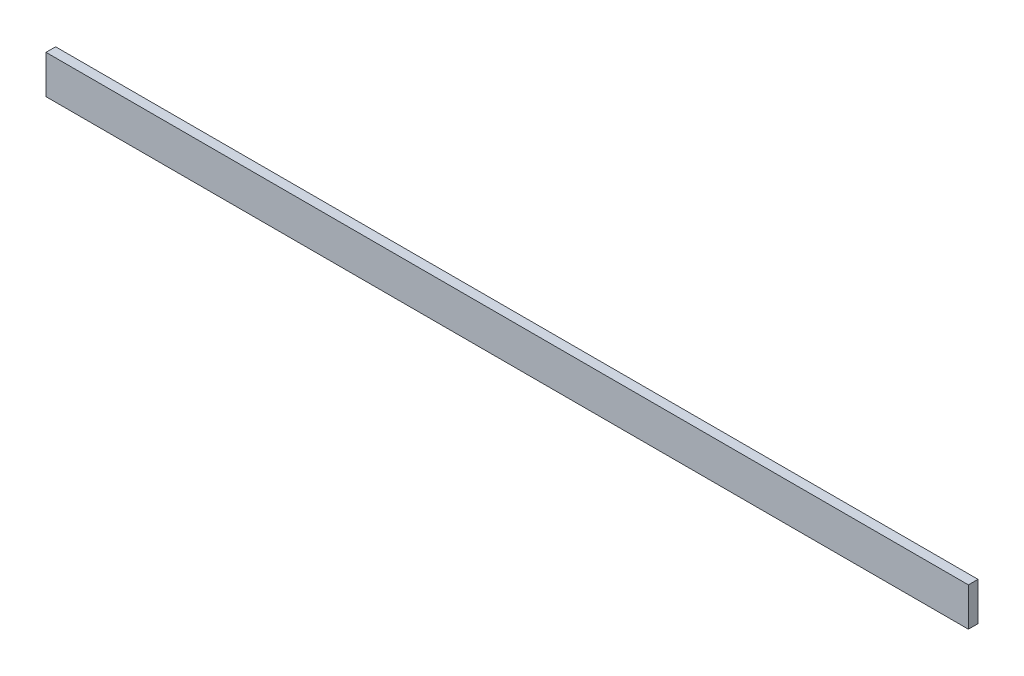
ISO-10303-21;
HEADER;
FILE_DESCRIPTION(('STEP AP214'),'2;1');
FILE_NAME('part.step','',(''),(''),'','','');
FILE_SCHEMA(('AUTOMOTIVE_DESIGN { 1 0 10303 214 1 1 1 1 }'));
ENDSEC;
DATA;
#1=APPLICATION_CONTEXT('core data for automotive mechanical design processes');
#2=APPLICATION_PROTOCOL_DEFINITION('international standard','automotive_design',2000,#1);
#3=PRODUCT_CONTEXT('',#1,'mechanical');
#4=PRODUCT('Part','Part','',(#3));
#5=PRODUCT_RELATED_PRODUCT_CATEGORY('part','',(#4));
#6=PRODUCT_DEFINITION_FORMATION('','',#4);
#7=PRODUCT_DEFINITION_CONTEXT('part definition',#1,'design');
#8=PRODUCT_DEFINITION('design','',#6,#7);
#9=PRODUCT_DEFINITION_SHAPE('','',#8);
#10=(LENGTH_UNIT() NAMED_UNIT(*) SI_UNIT(.MILLI.,.METRE.));
#11=(NAMED_UNIT(*) PLANE_ANGLE_UNIT() SI_UNIT($,.RADIAN.));
#12=(NAMED_UNIT(*) SI_UNIT($,.STERADIAN.) SOLID_ANGLE_UNIT());
#13=UNCERTAINTY_MEASURE_WITH_UNIT(LENGTH_MEASURE(1.E-05),#10,'distance_accuracy_value','');
#14=(GEOMETRIC_REPRESENTATION_CONTEXT(3) GLOBAL_UNCERTAINTY_ASSIGNED_CONTEXT((#13)) GLOBAL_UNIT_ASSIGNED_CONTEXT((#10,
#11,#12)) REPRESENTATION_CONTEXT('',''));
#15=CARTESIAN_POINT('',(0.,0.,0.));
#16=DIRECTION('',(0.,0.,1.));
#17=DIRECTION('',(1.,0.,0.));
#18=AXIS2_PLACEMENT_3D('',#15,#16,#17);
#19=CARTESIAN_POINT('',(2226.20272479564,-7.47465940054465,25.4));
#20=DIRECTION('',(-1.,0.,0.));
#21=DIRECTION('',(0.,0.,1.));
#22=AXIS2_PLACEMENT_3D('',#19,#20,#21);
#23=PLANE('',#22);
#24=DIRECTION('',(0.,1.,0.));
#25=VECTOR('',#24,1.);
#26=CARTESIAN_POINT('',(2226.20272479564,-7.47465940054465,0.));
#27=LINE('',#26,#25);
#28=CARTESIAN_POINT('',(2226.20272479564,-7.47465940054465,0.));
#29=VERTEX_POINT('',#28);
#30=CARTESIAN_POINT('',(2226.20272479564,94.1253405994553,0.));
#31=VERTEX_POINT('',#30);
#32=EDGE_CURVE('E97',#29,#31,#27,.T.);
#33=ORIENTED_EDGE('',*,*,#32,.T.);
#34=DIRECTION('',(0.,0.,-1.));
#35=VECTOR('',#34,1.);
#36=CARTESIAN_POINT('',(2226.20272479564,94.1253405994553,25.4));
#37=LINE('',#36,#35);
#38=CARTESIAN_POINT('',(2226.20272479564,94.1253405994553,25.4));
#39=VERTEX_POINT('',#38);
#40=EDGE_CURVE('E11',#39,#31,#37,.T.);
#41=ORIENTED_EDGE('',*,*,#40,.F.);
#42=DIRECTION('',(0.,1.,0.));
#43=VECTOR('',#42,1.);
#44=CARTESIAN_POINT('',(2226.20272479564,-7.47465940054465,25.4));
#45=LINE('',#44,#43);
#46=CARTESIAN_POINT('',(2226.20272479564,-7.47465940054465,25.4));
#47=VERTEX_POINT('',#46);
#48=EDGE_CURVE('E85',#47,#39,#45,.T.);
#49=ORIENTED_EDGE('',*,*,#48,.F.);
#50=DIRECTION('',(0.,0.,-1.));
#51=VECTOR('',#50,1.);
#52=CARTESIAN_POINT('',(2226.20272479564,-7.47465940054465,25.4));
#53=LINE('',#52,#51);
#54=EDGE_CURVE('E93',#47,#29,#53,.T.);
#55=ORIENTED_EDGE('',*,*,#54,.T.);
#56=EDGE_LOOP('',(#33,#41,#49,#55));
#57=FACE_BOUND('',#56,.T.);
#58=ADVANCED_FACE('F34',(#57),#23,.F.);
#59=CARTESIAN_POINT('',(2226.20272479564,94.1253405994553,25.4));
#60=DIRECTION('',(0.,-1.,0.));
#61=DIRECTION('',(1.,0.,0.));
#62=AXIS2_PLACEMENT_3D('',#59,#60,#61);
#63=PLANE('',#62);
#64=DIRECTION('',(-1.,0.,0.));
#65=VECTOR('',#64,1.);
#66=CARTESIAN_POINT('',(2226.20272479564,94.1253405994553,0.));
#67=LINE('',#66,#65);
#68=CARTESIAN_POINT('',(-212.19727520436,94.125340599455,0.));
#69=VERTEX_POINT('',#68);
#70=EDGE_CURVE('E89',#31,#69,#67,.T.);
#71=ORIENTED_EDGE('',*,*,#70,.T.);
#72=DIRECTION('',(0.,0.,-1.));
#73=VECTOR('',#72,1.);
#74=CARTESIAN_POINT('',(-212.19727520436,94.125340599455,25.4));
#75=LINE('',#74,#73);
#76=CARTESIAN_POINT('',(-212.19727520436,94.125340599455,25.4));
#77=VERTEX_POINT('',#76);
#78=EDGE_CURVE('E42',#77,#69,#75,.T.);
#79=ORIENTED_EDGE('',*,*,#78,.F.);
#80=DIRECTION('',(-1.,0.,0.));
#81=VECTOR('',#80,1.);
#82=CARTESIAN_POINT('',(2226.20272479564,94.1253405994553,25.4));
#83=LINE('',#82,#81);
#84=EDGE_CURVE('E80',#39,#77,#83,.T.);
#85=ORIENTED_EDGE('',*,*,#84,.F.);
#86=ORIENTED_EDGE('',*,*,#40,.T.);
#87=EDGE_LOOP('',(#71,#79,#85,#86));
#88=FACE_BOUND('',#87,.T.);
#89=ADVANCED_FACE('F88',(#88),#63,.F.);
#90=CARTESIAN_POINT('',(-212.19727520436,-7.47465940054495,25.4));
#91=DIRECTION('',(1.,0.,0.));
#92=DIRECTION('',(0.,0.,-1.));
#93=AXIS2_PLACEMENT_3D('',#90,#91,#92);
#94=PLANE('',#93);
#95=DIRECTION('',(0.,-1.,0.));
#96=VECTOR('',#95,1.);
#97=CARTESIAN_POINT('',(-212.19727520436,-7.47465940054495,0.));
#98=LINE('',#97,#96);
#99=CARTESIAN_POINT('',(-212.19727520436,-7.47465940054495,0.));
#100=VERTEX_POINT('',#99);
#101=EDGE_CURVE('E67',#69,#100,#98,.T.);
#102=ORIENTED_EDGE('',*,*,#101,.T.);
#103=DIRECTION('',(0.,0.,-1.));
#104=VECTOR('',#103,1.);
#105=CARTESIAN_POINT('',(-212.19727520436,-7.47465940054495,25.4));
#106=LINE('',#105,#104);
#107=CARTESIAN_POINT('',(-212.19727520436,-7.47465940054495,25.4));
#108=VERTEX_POINT('',#107);
#109=EDGE_CURVE('E90',#108,#100,#106,.T.);
#110=ORIENTED_EDGE('',*,*,#109,.F.);
#111=DIRECTION('',(0.,-1.,0.));
#112=VECTOR('',#111,1.);
#113=CARTESIAN_POINT('',(-212.19727520436,-7.47465940054495,25.4));
#114=LINE('',#113,#112);
#115=EDGE_CURVE('E83',#77,#108,#114,.T.);
#116=ORIENTED_EDGE('',*,*,#115,.F.);
#117=ORIENTED_EDGE('',*,*,#78,.T.);
#118=EDGE_LOOP('',(#102,#110,#116,#117));
#119=FACE_BOUND('',#118,.T.);
#120=ADVANCED_FACE('F91',(#119),#94,.F.);
#121=CARTESIAN_POINT('',(2226.20272479564,-7.47465940054465,25.4));
#122=DIRECTION('',(0.,1.,0.));
#123=DIRECTION('',(-1.,0.,0.));
#124=AXIS2_PLACEMENT_3D('',#121,#122,#123);
#125=PLANE('',#124);
#126=DIRECTION('',(1.,0.,0.));
#127=VECTOR('',#126,1.);
#128=CARTESIAN_POINT('',(2226.20272479564,-7.47465940054465,0.));
#129=LINE('',#128,#127);
#130=EDGE_CURVE('E73',#100,#29,#129,.T.);
#131=ORIENTED_EDGE('',*,*,#130,.T.);
#132=ORIENTED_EDGE('',*,*,#54,.F.);
#133=DIRECTION('',(1.,0.,0.));
#134=VECTOR('',#133,1.);
#135=CARTESIAN_POINT('',(2226.20272479564,-7.47465940054465,25.4));
#136=LINE('',#135,#134);
#137=EDGE_CURVE('E50',#108,#47,#136,.T.);
#138=ORIENTED_EDGE('',*,*,#137,.F.);
#139=ORIENTED_EDGE('',*,*,#109,.T.);
#140=EDGE_LOOP('',(#131,#132,#138,#139));
#141=FACE_BOUND('',#140,.T.);
#142=ADVANCED_FACE('F104',(#141),#125,.F.);
#143=CARTESIAN_POINT('',(0.,0.,25.4));
#144=DIRECTION('',(0.,0.,1.));
#145=DIRECTION('',(1.,0.,0.));
#146=AXIS2_PLACEMENT_3D('',#143,#144,#145);
#147=PLANE('',#146);
#148=ORIENTED_EDGE('',*,*,#48,.T.);
#149=ORIENTED_EDGE('',*,*,#84,.T.);
#150=ORIENTED_EDGE('',*,*,#115,.T.);
#151=ORIENTED_EDGE('',*,*,#137,.T.);
#152=EDGE_LOOP('',(#148,#149,#150,#151));
#153=FACE_BOUND('',#152,.T.);
#154=ADVANCED_FACE('F81',(#153),#147,.T.);
#155=CARTESIAN_POINT('',(0.,0.,0.));
#156=DIRECTION('',(0.,0.,1.));
#157=DIRECTION('',(1.,0.,0.));
#158=AXIS2_PLACEMENT_3D('',#155,#156,#157);
#159=PLANE('',#158);
#160=ORIENTED_EDGE('',*,*,#32,.F.);
#161=ORIENTED_EDGE('',*,*,#130,.F.);
#162=ORIENTED_EDGE('',*,*,#101,.F.);
#163=ORIENTED_EDGE('',*,*,#70,.F.);
#164=EDGE_LOOP('',(#160,#161,#162,#163));
#165=FACE_BOUND('',#164,.T.);
#166=ADVANCED_FACE('F107',(#165),#159,.F.);
#167=CLOSED_SHELL('',(#58,#89,#120,#142,#154,#166));
#168=MANIFOLD_SOLID_BREP('B2',#167);
#169=ADVANCED_BREP_SHAPE_REPRESENTATION('',(#18,#168),#14);
#170=SHAPE_DEFINITION_REPRESENTATION(#9,#169);
ENDSEC;
END-ISO-10303-21;
